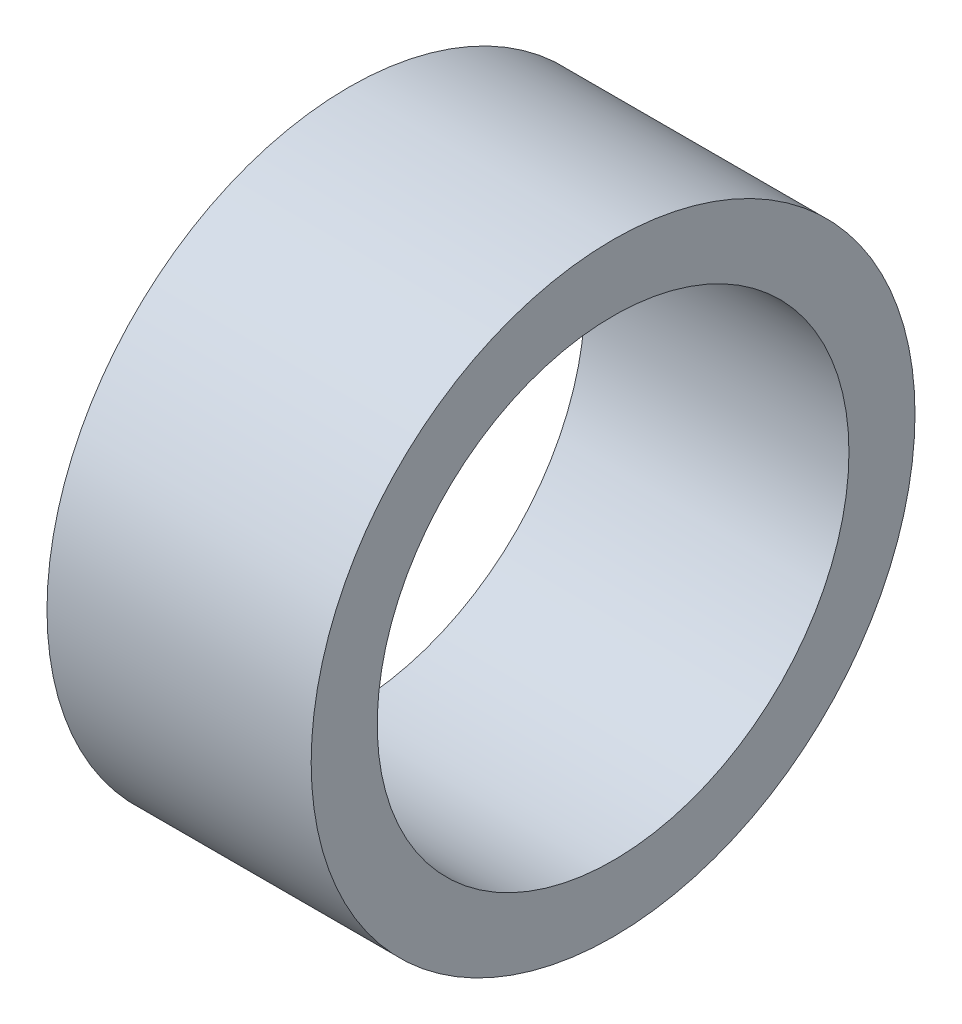
ISO-10303-21;
HEADER;
FILE_DESCRIPTION(('STEP AP214'),'2;1');
FILE_NAME('part.step','',(''),(''),'','','');
FILE_SCHEMA(('AUTOMOTIVE_DESIGN { 1 0 10303 214 1 1 1 1 }'));
ENDSEC;
DATA;
#1=APPLICATION_CONTEXT('core data for automotive mechanical design processes');
#2=APPLICATION_PROTOCOL_DEFINITION('international standard','automotive_design',2000,#1);
#3=PRODUCT_CONTEXT('',#1,'mechanical');
#4=PRODUCT('Part','Part','',(#3));
#5=PRODUCT_RELATED_PRODUCT_CATEGORY('part','',(#4));
#6=PRODUCT_DEFINITION_FORMATION('','',#4);
#7=PRODUCT_DEFINITION_CONTEXT('part definition',#1,'design');
#8=PRODUCT_DEFINITION('design','',#6,#7);
#9=PRODUCT_DEFINITION_SHAPE('','',#8);
#10=(LENGTH_UNIT() NAMED_UNIT(*) SI_UNIT(.MILLI.,.METRE.));
#11=(NAMED_UNIT(*) PLANE_ANGLE_UNIT() SI_UNIT($,.RADIAN.));
#12=(NAMED_UNIT(*) SI_UNIT($,.STERADIAN.) SOLID_ANGLE_UNIT());
#13=UNCERTAINTY_MEASURE_WITH_UNIT(LENGTH_MEASURE(1.E-05),#10,'distance_accuracy_value','');
#14=(GEOMETRIC_REPRESENTATION_CONTEXT(3) GLOBAL_UNCERTAINTY_ASSIGNED_CONTEXT((#13)) GLOBAL_UNIT_ASSIGNED_CONTEXT((#10,
#11,#12)) REPRESENTATION_CONTEXT('',''));
#15=CARTESIAN_POINT('',(0.,0.,0.));
#16=DIRECTION('',(0.,0.,1.));
#17=DIRECTION('',(1.,0.,0.));
#18=AXIS2_PLACEMENT_3D('',#15,#16,#17);
#19=CARTESIAN_POINT('',(7.,0.,0.));
#20=DIRECTION('',(1.,0.,0.));
#21=DIRECTION('',(0.,0.,-1.));
#22=AXIS2_PLACEMENT_3D('',#19,#20,#21);
#23=PLANE('',#22);
#24=CARTESIAN_POINT('',(7.,0.,0.));
#25=DIRECTION('',(1.,0.,0.));
#26=DIRECTION('',(0.,0.,-1.));
#27=AXIS2_PLACEMENT_3D('',#24,#25,#26);
#28=CIRCLE('',#27,8.);
#29=CARTESIAN_POINT('',(7.,0.,-8.));
#30=VERTEX_POINT('',#29);
#31=EDGE_CURVE('E10',#30,#30,#28,.T.);
#32=ORIENTED_EDGE('',*,*,#31,.T.);
#33=EDGE_LOOP('',(#32));
#34=FACE_BOUND('',#33,.T.);
#35=CARTESIAN_POINT('',(7.,0.,0.));
#36=DIRECTION('',(1.,0.,0.));
#37=DIRECTION('',(0.,0.,-1.));
#38=AXIS2_PLACEMENT_3D('',#35,#36,#37);
#39=CIRCLE('',#38,6.25);
#40=CARTESIAN_POINT('',(7.,0.,-6.25));
#41=VERTEX_POINT('',#40);
#42=EDGE_CURVE('E42',#41,#41,#39,.T.);
#43=ORIENTED_EDGE('',*,*,#42,.F.);
#44=EDGE_LOOP('',(#43));
#45=FACE_BOUND('',#44,.T.);
#46=ADVANCED_FACE('F31',(#34,#45),#23,.T.);
#47=CARTESIAN_POINT('',(0.,0.,0.));
#48=DIRECTION('',(1.,0.,0.));
#49=DIRECTION('',(0.,0.,-1.));
#50=AXIS2_PLACEMENT_3D('',#47,#48,#49);
#51=PLANE('',#50);
#52=CARTESIAN_POINT('',(0.,0.,0.));
#53=DIRECTION('',(1.,0.,0.));
#54=DIRECTION('',(0.,0.,-1.));
#55=AXIS2_PLACEMENT_3D('',#52,#53,#54);
#56=CIRCLE('',#55,8.);
#57=CARTESIAN_POINT('',(0.,0.,-8.));
#58=VERTEX_POINT('',#57);
#59=EDGE_CURVE('E35',#58,#58,#56,.T.);
#60=ORIENTED_EDGE('',*,*,#59,.F.);
#61=EDGE_LOOP('',(#60));
#62=FACE_BOUND('',#61,.T.);
#63=CARTESIAN_POINT('',(0.,0.,0.));
#64=DIRECTION('',(1.,0.,0.));
#65=DIRECTION('',(0.,0.,-1.));
#66=AXIS2_PLACEMENT_3D('',#63,#64,#65);
#67=CIRCLE('',#66,6.25);
#68=CARTESIAN_POINT('',(0.,0.,-6.25));
#69=VERTEX_POINT('',#68);
#70=EDGE_CURVE('E44',#69,#69,#67,.T.);
#71=ORIENTED_EDGE('',*,*,#70,.T.);
#72=EDGE_LOOP('',(#71));
#73=FACE_BOUND('',#72,.T.);
#74=ADVANCED_FACE('F54',(#62,#73),#51,.F.);
#75=CARTESIAN_POINT('',(7.,0.,0.));
#76=DIRECTION('',(-1.,0.,0.));
#77=DIRECTION('',(0.,0.,1.));
#78=AXIS2_PLACEMENT_3D('',#75,#76,#77);
#79=CYLINDRICAL_SURFACE('',#78,8.);
#80=ORIENTED_EDGE('',*,*,#31,.F.);
#81=EDGE_LOOP('',(#80));
#82=FACE_BOUND('',#81,.T.);
#83=ORIENTED_EDGE('',*,*,#59,.T.);
#84=EDGE_LOOP('',(#83));
#85=FACE_BOUND('',#84,.T.);
#86=ADVANCED_FACE('F33',(#82,#85),#79,.T.);
#87=CARTESIAN_POINT('',(7.,0.,0.));
#88=DIRECTION('',(-1.,0.,0.));
#89=DIRECTION('',(0.,0.,1.));
#90=AXIS2_PLACEMENT_3D('',#87,#88,#89);
#91=CYLINDRICAL_SURFACE('',#90,6.25);
#92=ORIENTED_EDGE('',*,*,#42,.T.);
#93=EDGE_LOOP('',(#92));
#94=FACE_BOUND('',#93,.T.);
#95=ORIENTED_EDGE('',*,*,#70,.F.);
#96=EDGE_LOOP('',(#95));
#97=FACE_BOUND('',#96,.T.);
#98=ADVANCED_FACE('F50',(#94,#97),#91,.F.);
#99=CLOSED_SHELL('',(#46,#74,#86,#98));
#100=MANIFOLD_SOLID_BREP('B2',#99);
#101=ADVANCED_BREP_SHAPE_REPRESENTATION('',(#18,#100),#14);
#102=SHAPE_DEFINITION_REPRESENTATION(#9,#101);
ENDSEC;
END-ISO-10303-21;
